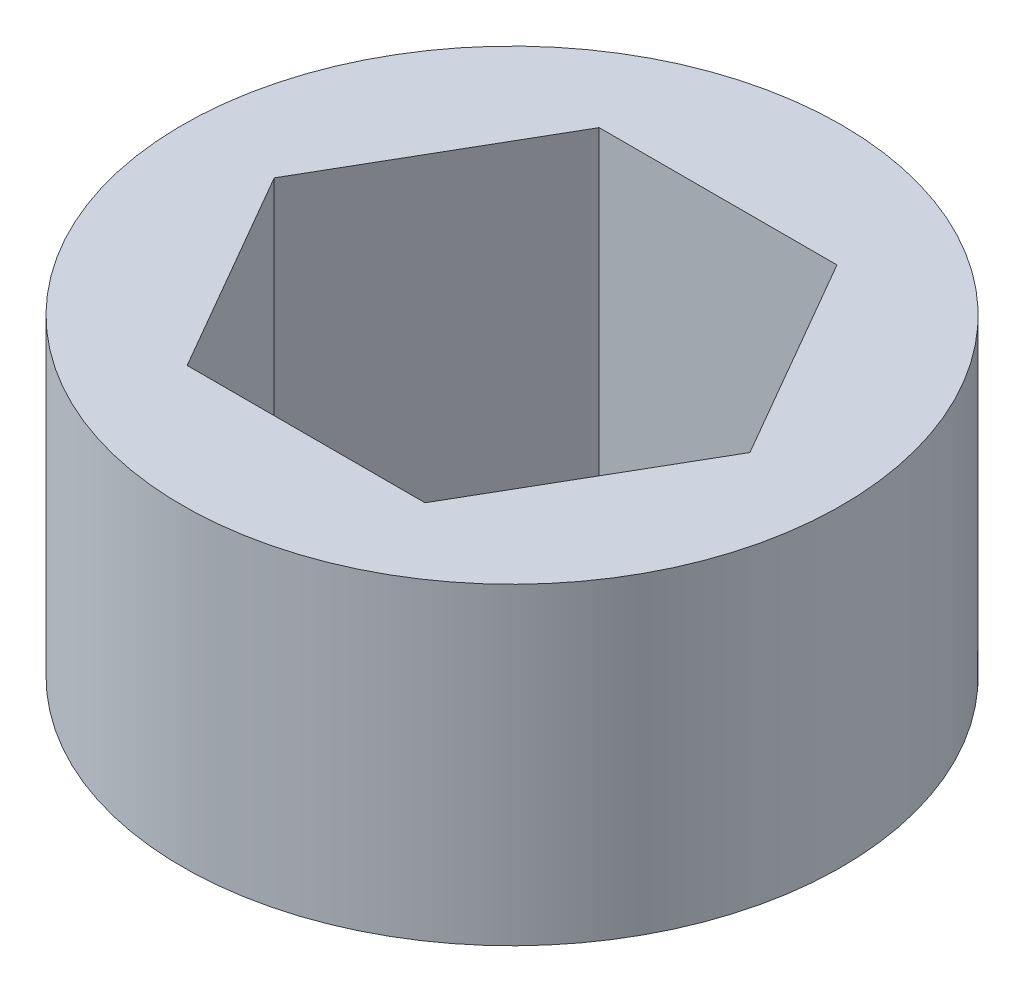
ISO-10303-21;
HEADER;
FILE_DESCRIPTION(('STEP AP214'),'2;1');
FILE_NAME('part.step','',(''),(''),'','','');
FILE_SCHEMA(('AUTOMOTIVE_DESIGN { 1 0 10303 214 1 1 1 1 }'));
ENDSEC;
DATA;
#1=APPLICATION_CONTEXT('core data for automotive mechanical design processes');
#2=APPLICATION_PROTOCOL_DEFINITION('international standard','automotive_design',2000,#1);
#3=PRODUCT_CONTEXT('',#1,'mechanical');
#4=PRODUCT('Part','Part','',(#3));
#5=PRODUCT_RELATED_PRODUCT_CATEGORY('part','',(#4));
#6=PRODUCT_DEFINITION_FORMATION('','',#4);
#7=PRODUCT_DEFINITION_CONTEXT('part definition',#1,'design');
#8=PRODUCT_DEFINITION('design','',#6,#7);
#9=PRODUCT_DEFINITION_SHAPE('','',#8);
#10=(LENGTH_UNIT() NAMED_UNIT(*) SI_UNIT(.MILLI.,.METRE.));
#11=(NAMED_UNIT(*) PLANE_ANGLE_UNIT() SI_UNIT($,.RADIAN.));
#12=(NAMED_UNIT(*) SI_UNIT($,.STERADIAN.) SOLID_ANGLE_UNIT());
#13=UNCERTAINTY_MEASURE_WITH_UNIT(LENGTH_MEASURE(1.E-05),#10,'distance_accuracy_value','');
#14=(GEOMETRIC_REPRESENTATION_CONTEXT(3) GLOBAL_UNCERTAINTY_ASSIGNED_CONTEXT((#13)) GLOBAL_UNIT_ASSIGNED_CONTEXT((#10,
#11,#12)) REPRESENTATION_CONTEXT('',''));
#15=CARTESIAN_POINT('',(0.,0.,0.));
#16=DIRECTION('',(0.,0.,1.));
#17=DIRECTION('',(1.,0.,0.));
#18=AXIS2_PLACEMENT_3D('',#15,#16,#17);
#19=CARTESIAN_POINT('',(0.,3.8,0.));
#20=DIRECTION('',(0.,1.,0.));
#21=DIRECTION('',(0.,0.,1.));
#22=AXIS2_PLACEMENT_3D('',#19,#20,#21);
#23=PLANE('',#22);
#24=CARTESIAN_POINT('',(0.,3.8,0.));
#25=DIRECTION('',(0.,1.,0.));
#26=DIRECTION('',(0.,0.,1.));
#27=AXIS2_PLACEMENT_3D('',#24,#25,#26);
#28=CIRCLE('',#27,4.);
#29=CARTESIAN_POINT('',(0.,3.8,-4.));
#30=VERTEX_POINT('',#29);
#31=EDGE_CURVE('E11',#30,#30,#28,.T.);
#32=ORIENTED_EDGE('',*,*,#31,.T.);
#33=EDGE_LOOP('',(#32));
#34=FACE_BOUND('',#33,.T.);
#35=DIRECTION('',(-0.499999999999998,0.,-0.86602540378444));
#36=VECTOR('',#35,1.);
#37=CARTESIAN_POINT('',(2.88675134594813,3.8,0.));
#38=LINE('',#37,#36);
#39=CARTESIAN_POINT('',(2.88675134594813,3.8,0.));
#40=VERTEX_POINT('',#39);
#41=CARTESIAN_POINT('',(1.44337567297406,3.8,-2.50000000000002));
#42=VERTEX_POINT('',#41);
#43=EDGE_CURVE('E94',#40,#42,#38,.T.);
#44=ORIENTED_EDGE('',*,*,#43,.F.);
#45=DIRECTION('',(0.5,0.,-0.866025403784438));
#46=VECTOR('',#45,1.);
#47=CARTESIAN_POINT('',(1.44337567297406,3.8,2.50000000000001));
#48=LINE('',#47,#46);
#49=CARTESIAN_POINT('',(1.44337567297406,3.8,2.50000000000001));
#50=VERTEX_POINT('',#49);
#51=EDGE_CURVE('E86',#50,#40,#48,.T.);
#52=ORIENTED_EDGE('',*,*,#51,.F.);
#53=DIRECTION('',(1.,0.,0.));
#54=VECTOR('',#53,1.);
#55=CARTESIAN_POINT('',(-1.44337567297408,3.8,2.50000000000001));
#56=LINE('',#55,#54);
#57=CARTESIAN_POINT('',(-1.44337567297408,3.8,2.50000000000001));
#58=VERTEX_POINT('',#57);
#59=EDGE_CURVE('E114',#58,#50,#56,.T.);
#60=ORIENTED_EDGE('',*,*,#59,.F.);
#61=DIRECTION('',(0.5,0.,0.866025403784438));
#62=VECTOR('',#61,1.);
#63=CARTESIAN_POINT('',(-2.88675134594815,3.8,0.));
#64=LINE('',#63,#62);
#65=CARTESIAN_POINT('',(-2.88675134594815,3.8,0.));
#66=VERTEX_POINT('',#65);
#67=EDGE_CURVE('E112',#66,#58,#64,.T.);
#68=ORIENTED_EDGE('',*,*,#67,.F.);
#69=DIRECTION('',(-0.5,0.,0.866025403784439));
#70=VECTOR('',#69,1.);
#71=CARTESIAN_POINT('',(-1.44337567297407,3.8,-2.50000000000002));
#72=LINE('',#71,#70);
#73=CARTESIAN_POINT('',(-1.44337567297407,3.8,-2.50000000000002));
#74=VERTEX_POINT('',#73);
#75=EDGE_CURVE('E108',#74,#66,#72,.T.);
#76=ORIENTED_EDGE('',*,*,#75,.F.);
#77=DIRECTION('',(-1.,0.,0.));
#78=VECTOR('',#77,1.);
#79=CARTESIAN_POINT('',(1.44337567297406,3.8,-2.50000000000002));
#80=LINE('',#79,#78);
#81=EDGE_CURVE('E106',#42,#74,#80,.T.);
#82=ORIENTED_EDGE('',*,*,#81,.F.);
#83=EDGE_LOOP('',(#44,#52,#60,#68,#76,#82));
#84=FACE_BOUND('',#83,.T.);
#85=ADVANCED_FACE('F33',(#34,#84),#23,.T.);
#86=CARTESIAN_POINT('',(0.,0.,0.));
#87=DIRECTION('',(0.,1.,0.));
#88=DIRECTION('',(0.,0.,1.));
#89=AXIS2_PLACEMENT_3D('',#86,#87,#88);
#90=PLANE('',#89);
#91=CARTESIAN_POINT('',(0.,0.,0.));
#92=DIRECTION('',(0.,1.,0.));
#93=DIRECTION('',(0.,0.,1.));
#94=AXIS2_PLACEMENT_3D('',#91,#92,#93);
#95=CIRCLE('',#94,4.);
#96=CARTESIAN_POINT('',(0.,0.,-4.));
#97=VERTEX_POINT('',#96);
#98=EDGE_CURVE('E37',#97,#97,#95,.T.);
#99=ORIENTED_EDGE('',*,*,#98,.F.);
#100=EDGE_LOOP('',(#99));
#101=FACE_BOUND('',#100,.T.);
#102=DIRECTION('',(0.5,0.,-0.866025403784438));
#103=VECTOR('',#102,1.);
#104=CARTESIAN_POINT('',(1.44337567297406,0.,2.50000000000001));
#105=LINE('',#104,#103);
#106=CARTESIAN_POINT('',(1.44337567297406,0.,2.50000000000001));
#107=VERTEX_POINT('',#106);
#108=CARTESIAN_POINT('',(2.88675134594813,0.,0.));
#109=VERTEX_POINT('',#108);
#110=EDGE_CURVE('E56',#107,#109,#105,.T.);
#111=ORIENTED_EDGE('',*,*,#110,.T.);
#112=DIRECTION('',(-0.499999999999998,0.,-0.86602540378444));
#113=VECTOR('',#112,1.);
#114=CARTESIAN_POINT('',(2.88675134594813,0.,0.));
#115=LINE('',#114,#113);
#116=CARTESIAN_POINT('',(1.44337567297406,0.,-2.50000000000002));
#117=VERTEX_POINT('',#116);
#118=EDGE_CURVE('E101',#109,#117,#115,.T.);
#119=ORIENTED_EDGE('',*,*,#118,.T.);
#120=DIRECTION('',(-1.,0.,0.));
#121=VECTOR('',#120,1.);
#122=CARTESIAN_POINT('',(1.44337567297406,0.,-2.50000000000002));
#123=LINE('',#122,#121);
#124=CARTESIAN_POINT('',(-1.44337567297407,0.,-2.50000000000002));
#125=VERTEX_POINT('',#124);
#126=EDGE_CURVE('E118',#117,#125,#123,.T.);
#127=ORIENTED_EDGE('',*,*,#126,.T.);
#128=DIRECTION('',(-0.5,0.,0.866025403784439));
#129=VECTOR('',#128,1.);
#130=CARTESIAN_POINT('',(-1.44337567297407,0.,-2.50000000000002));
#131=LINE('',#130,#129);
#132=CARTESIAN_POINT('',(-2.88675134594815,0.,0.));
#133=VERTEX_POINT('',#132);
#134=EDGE_CURVE('E121',#125,#133,#131,.T.);
#135=ORIENTED_EDGE('',*,*,#134,.T.);
#136=DIRECTION('',(0.5,0.,0.866025403784438));
#137=VECTOR('',#136,1.);
#138=CARTESIAN_POINT('',(-2.88675134594815,0.,0.));
#139=LINE('',#138,#137);
#140=CARTESIAN_POINT('',(-1.44337567297408,0.,2.50000000000001));
#141=VERTEX_POINT('',#140);
#142=EDGE_CURVE('E124',#133,#141,#139,.T.);
#143=ORIENTED_EDGE('',*,*,#142,.T.);
#144=DIRECTION('',(1.,0.,0.));
#145=VECTOR('',#144,1.);
#146=CARTESIAN_POINT('',(-1.44337567297408,0.,2.50000000000001));
#147=LINE('',#146,#145);
#148=EDGE_CURVE('E95',#141,#107,#147,.T.);
#149=ORIENTED_EDGE('',*,*,#148,.T.);
#150=EDGE_LOOP('',(#111,#119,#127,#135,#143,#149));
#151=FACE_BOUND('',#150,.T.);
#152=ADVANCED_FACE('F141',(#101,#151),#90,.F.);
#153=CARTESIAN_POINT('',(0.,3.8,0.));
#154=DIRECTION('',(0.,-1.,0.));
#155=DIRECTION('',(0.,0.,-1.));
#156=AXIS2_PLACEMENT_3D('',#153,#154,#155);
#157=CYLINDRICAL_SURFACE('',#156,4.);
#158=CARTESIAN_POINT('',(0.,3.8,-4.));
#159=CARTESIAN_POINT('',(0.,3.76041666666667,-4.));
#160=CARTESIAN_POINT('',(0.,3.72083333333333,-4.));
#161=CARTESIAN_POINT('',(0.,3.64166666666667,-4.));
#162=CARTESIAN_POINT('',(0.,3.60208333333333,-4.));
#163=CARTESIAN_POINT('',(0.,3.52291666666667,-4.));
#164=CARTESIAN_POINT('',(0.,3.48333333333333,-4.));
#165=CARTESIAN_POINT('',(0.,3.40416666666667,-4.));
#166=CARTESIAN_POINT('',(0.,3.36458333333333,-4.));
#167=CARTESIAN_POINT('',(0.,3.28541666666667,-4.));
#168=CARTESIAN_POINT('',(0.,3.24583333333333,-4.));
#169=CARTESIAN_POINT('',(0.,3.16666666666667,-4.));
#170=CARTESIAN_POINT('',(0.,3.12708333333333,-4.));
#171=CARTESIAN_POINT('',(0.,3.04791666666667,-4.));
#172=CARTESIAN_POINT('',(0.,3.00833333333333,-4.));
#173=CARTESIAN_POINT('',(0.,2.92916666666667,-4.));
#174=CARTESIAN_POINT('',(0.,2.88958333333333,-4.));
#175=CARTESIAN_POINT('',(0.,2.81041666666667,-4.));
#176=CARTESIAN_POINT('',(0.,2.77083333333333,-4.));
#177=CARTESIAN_POINT('',(0.,2.69166666666667,-4.));
#178=CARTESIAN_POINT('',(0.,2.65208333333333,-4.));
#179=CARTESIAN_POINT('',(0.,2.57291666666667,-4.));
#180=CARTESIAN_POINT('',(0.,2.53333333333333,-4.));
#181=CARTESIAN_POINT('',(0.,2.45416666666667,-4.));
#182=CARTESIAN_POINT('',(0.,2.41458333333333,-4.));
#183=CARTESIAN_POINT('',(0.,2.33541666666667,-4.));
#184=CARTESIAN_POINT('',(0.,2.29583333333333,-4.));
#185=CARTESIAN_POINT('',(0.,2.21666666666667,-4.));
#186=CARTESIAN_POINT('',(0.,2.17708333333333,-4.));
#187=CARTESIAN_POINT('',(0.,2.09791666666667,-4.));
#188=CARTESIAN_POINT('',(0.,2.05833333333333,-4.));
#189=CARTESIAN_POINT('',(0.,1.97916666666667,-4.));
#190=CARTESIAN_POINT('',(0.,1.93958333333333,-4.));
#191=CARTESIAN_POINT('',(0.,1.86041666666667,-4.));
#192=CARTESIAN_POINT('',(0.,1.82083333333333,-4.));
#193=CARTESIAN_POINT('',(0.,1.74166666666667,-4.));
#194=CARTESIAN_POINT('',(0.,1.70208333333333,-4.));
#195=CARTESIAN_POINT('',(0.,1.62291666666667,-4.));
#196=CARTESIAN_POINT('',(0.,1.58333333333333,-4.));
#197=CARTESIAN_POINT('',(0.,1.50416666666667,-4.));
#198=CARTESIAN_POINT('',(0.,1.46458333333333,-4.));
#199=CARTESIAN_POINT('',(0.,1.38541666666667,-4.));
#200=CARTESIAN_POINT('',(0.,1.34583333333333,-4.));
#201=CARTESIAN_POINT('',(0.,1.26666666666667,-4.));
#202=CARTESIAN_POINT('',(0.,1.22708333333333,-4.));
#203=CARTESIAN_POINT('',(0.,1.14791666666667,-4.));
#204=CARTESIAN_POINT('',(0.,1.10833333333333,-4.));
#205=CARTESIAN_POINT('',(0.,1.02916666666667,-4.));
#206=CARTESIAN_POINT('',(0.,0.989583333333334,-4.));
#207=CARTESIAN_POINT('',(0.,0.910416666666667,-4.));
#208=CARTESIAN_POINT('',(0.,0.870833333333333,-4.));
#209=CARTESIAN_POINT('',(0.,0.791666666666667,-4.));
#210=CARTESIAN_POINT('',(0.,0.752083333333333,-4.));
#211=CARTESIAN_POINT('',(0.,0.672916666666667,-4.));
#212=CARTESIAN_POINT('',(0.,0.633333333333333,-4.));
#213=CARTESIAN_POINT('',(0.,0.554166666666667,-4.));
#214=CARTESIAN_POINT('',(0.,0.514583333333334,-4.));
#215=CARTESIAN_POINT('',(0.,0.435416666666667,-4.));
#216=CARTESIAN_POINT('',(0.,0.395833333333334,-4.));
#217=CARTESIAN_POINT('',(0.,0.316666666666667,-4.));
#218=CARTESIAN_POINT('',(0.,0.277083333333333,-4.));
#219=CARTESIAN_POINT('',(0.,0.197916666666667,-4.));
#220=CARTESIAN_POINT('',(0.,0.158333333333333,-4.));
#221=CARTESIAN_POINT('',(0.,0.0791666666666666,-4.));
#222=CARTESIAN_POINT('',(0.,0.0395833333333333,-4.));
#223=CARTESIAN_POINT('',(0.,0.,-4.));
#224=B_SPLINE_CURVE_WITH_KNOTS('',3,(#158,#159,#160,#161,#162,#163,#164,#165,#166,#167,#168,
#169,#170,#171,#172,#173,#174,#175,#176,#177,#178,#179,#180,#181,#182,#183,#184,#185,#186,#187,
#188,#189,#190,#191,#192,#193,#194,#195,#196,#197,#198,#199,#200,#201,#202,#203,#204,#205,#206,
#207,#208,#209,#210,#211,#212,#213,#214,#215,#216,#217,#218,#219,#220,#221,#222,#223),
.UNSPECIFIED.,.F.,.F.,(4,2,2,2,2,2,2,2,2,2,2,2,2,2,2,2,2,2,2,2,2,2,2,2,2,2,2,2,2,2,2,2,4),(0.,
0.11875,0.2375,0.35625,0.475,0.59375,0.7125,0.83125,0.95,1.06875,1.1875,1.30625,1.425,1.54375,
1.6625,1.78125,1.9,2.01875,2.1375,2.25625,2.375,2.49375,2.6125,2.73125,2.85,2.96875,3.0875,
3.20625,3.325,3.44375,3.5625,3.68125,3.8),.UNSPECIFIED.);
#225=EDGE_CURVE('BSEAM35',#30,#97,#224,.T.);
#226=ORIENTED_EDGE('',*,*,#31,.F.);
#227=ORIENTED_EDGE('',*,*,#98,.T.);
#228=ORIENTED_EDGE('',*,*,#225,.T.);
#229=ORIENTED_EDGE('',*,*,#225,.F.);
#230=EDGE_LOOP('',(#226,#228,#227,#229));
#231=FACE_BOUND('',#230,.T.);
#232=ADVANCED_FACE('F35',(#231),#157,.T.);
#233=CARTESIAN_POINT('',(1.44337567297406,3.8,2.50000000000001));
#234=DIRECTION('',(-0.866025403784438,0.,-0.5));
#235=DIRECTION('',(-0.5,0.,0.866025403784439));
#236=AXIS2_PLACEMENT_3D('',#233,#234,#235);
#237=PLANE('',#236);
#238=ORIENTED_EDGE('',*,*,#110,.F.);
#239=DIRECTION('',(0.,-1.,0.));
#240=VECTOR('',#239,1.);
#241=CARTESIAN_POINT('',(1.44337567297406,3.8,2.50000000000001));
#242=LINE('',#241,#240);
#243=EDGE_CURVE('E90',#50,#107,#242,.T.);
#244=ORIENTED_EDGE('',*,*,#243,.F.);
#245=ORIENTED_EDGE('',*,*,#51,.T.);
#246=DIRECTION('',(0.,-1.,0.));
#247=VECTOR('',#246,1.);
#248=CARTESIAN_POINT('',(2.88675134594813,3.8,0.));
#249=LINE('',#248,#247);
#250=EDGE_CURVE('E89',#40,#109,#249,.T.);
#251=ORIENTED_EDGE('',*,*,#250,.T.);
#252=EDGE_LOOP('',(#238,#244,#245,#251));
#253=FACE_BOUND('',#252,.T.);
#254=ADVANCED_FACE('F88',(#253),#237,.T.);
#255=CARTESIAN_POINT('',(2.88675134594813,3.8,0.));
#256=DIRECTION('',(-0.86602540378444,0.,0.499999999999998));
#257=DIRECTION('',(0.499999999999998,0.,0.86602540378444));
#258=AXIS2_PLACEMENT_3D('',#255,#256,#257);
#259=PLANE('',#258);
#260=ORIENTED_EDGE('',*,*,#118,.F.);
#261=ORIENTED_EDGE('',*,*,#250,.F.);
#262=ORIENTED_EDGE('',*,*,#43,.T.);
#263=DIRECTION('',(0.,-1.,0.));
#264=VECTOR('',#263,1.);
#265=CARTESIAN_POINT('',(1.44337567297406,3.8,-2.50000000000002));
#266=LINE('',#265,#264);
#267=EDGE_CURVE('E102',#42,#117,#266,.T.);
#268=ORIENTED_EDGE('',*,*,#267,.T.);
#269=EDGE_LOOP('',(#260,#261,#262,#268));
#270=FACE_BOUND('',#269,.T.);
#271=ADVANCED_FACE('F98',(#270),#259,.T.);
#272=CARTESIAN_POINT('',(1.44337567297406,3.8,-2.50000000000002));
#273=DIRECTION('',(0.,0.,1.));
#274=DIRECTION('',(1.,0.,0.));
#275=AXIS2_PLACEMENT_3D('',#272,#273,#274);
#276=PLANE('',#275);
#277=ORIENTED_EDGE('',*,*,#126,.F.);
#278=ORIENTED_EDGE('',*,*,#267,.F.);
#279=ORIENTED_EDGE('',*,*,#81,.T.);
#280=DIRECTION('',(0.,-1.,0.));
#281=VECTOR('',#280,1.);
#282=CARTESIAN_POINT('',(-1.44337567297407,3.8,-2.50000000000002));
#283=LINE('',#282,#281);
#284=EDGE_CURVE('E133',#74,#125,#283,.T.);
#285=ORIENTED_EDGE('',*,*,#284,.T.);
#286=EDGE_LOOP('',(#277,#278,#279,#285));
#287=FACE_BOUND('',#286,.T.);
#288=ADVANCED_FACE('F137',(#287),#276,.T.);
#289=CARTESIAN_POINT('',(-1.44337567297407,3.8,-2.50000000000002));
#290=DIRECTION('',(0.866025403784438,0.,0.5));
#291=DIRECTION('',(0.5,0.,-0.866025403784439));
#292=AXIS2_PLACEMENT_3D('',#289,#290,#291);
#293=PLANE('',#292);
#294=ORIENTED_EDGE('',*,*,#134,.F.);
#295=ORIENTED_EDGE('',*,*,#284,.F.);
#296=ORIENTED_EDGE('',*,*,#75,.T.);
#297=DIRECTION('',(0.,-1.,0.));
#298=VECTOR('',#297,1.);
#299=CARTESIAN_POINT('',(-2.88675134594815,3.8,0.));
#300=LINE('',#299,#298);
#301=EDGE_CURVE('E131',#66,#133,#300,.T.);
#302=ORIENTED_EDGE('',*,*,#301,.T.);
#303=EDGE_LOOP('',(#294,#295,#296,#302));
#304=FACE_BOUND('',#303,.T.);
#305=ADVANCED_FACE('F149',(#304),#293,.T.);
#306=CARTESIAN_POINT('',(-2.88675134594815,3.8,0.));
#307=DIRECTION('',(0.866025403784438,0.,-0.5));
#308=DIRECTION('',(-0.5,0.,-0.866025403784439));
#309=AXIS2_PLACEMENT_3D('',#306,#307,#308);
#310=PLANE('',#309);
#311=ORIENTED_EDGE('',*,*,#142,.F.);
#312=ORIENTED_EDGE('',*,*,#301,.F.);
#313=ORIENTED_EDGE('',*,*,#67,.T.);
#314=DIRECTION('',(0.,-1.,0.));
#315=VECTOR('',#314,1.);
#316=CARTESIAN_POINT('',(-1.44337567297408,3.8,2.50000000000001));
#317=LINE('',#316,#315);
#318=EDGE_CURVE('E48',#58,#141,#317,.T.);
#319=ORIENTED_EDGE('',*,*,#318,.T.);
#320=EDGE_LOOP('',(#311,#312,#313,#319));
#321=FACE_BOUND('',#320,.T.);
#322=ADVANCED_FACE('F147',(#321),#310,.T.);
#323=CARTESIAN_POINT('',(-1.44337567297408,3.8,2.50000000000001));
#324=DIRECTION('',(0.,0.,-1.));
#325=DIRECTION('',(-1.,0.,0.));
#326=AXIS2_PLACEMENT_3D('',#323,#324,#325);
#327=PLANE('',#326);
#328=ORIENTED_EDGE('',*,*,#148,.F.);
#329=ORIENTED_EDGE('',*,*,#318,.F.);
#330=ORIENTED_EDGE('',*,*,#59,.T.);
#331=ORIENTED_EDGE('',*,*,#243,.T.);
#332=EDGE_LOOP('',(#328,#329,#330,#331));
#333=FACE_BOUND('',#332,.T.);
#334=ADVANCED_FACE('F143',(#333),#327,.T.);
#335=CLOSED_SHELL('',(#85,#152,#232,#254,#271,#288,#305,#322,#334));
#336=MANIFOLD_SOLID_BREP('B2',#335);
#337=ADVANCED_BREP_SHAPE_REPRESENTATION('',(#18,#336),#14);
#338=SHAPE_DEFINITION_REPRESENTATION(#9,#337);
ENDSEC;
END-ISO-10303-21;
